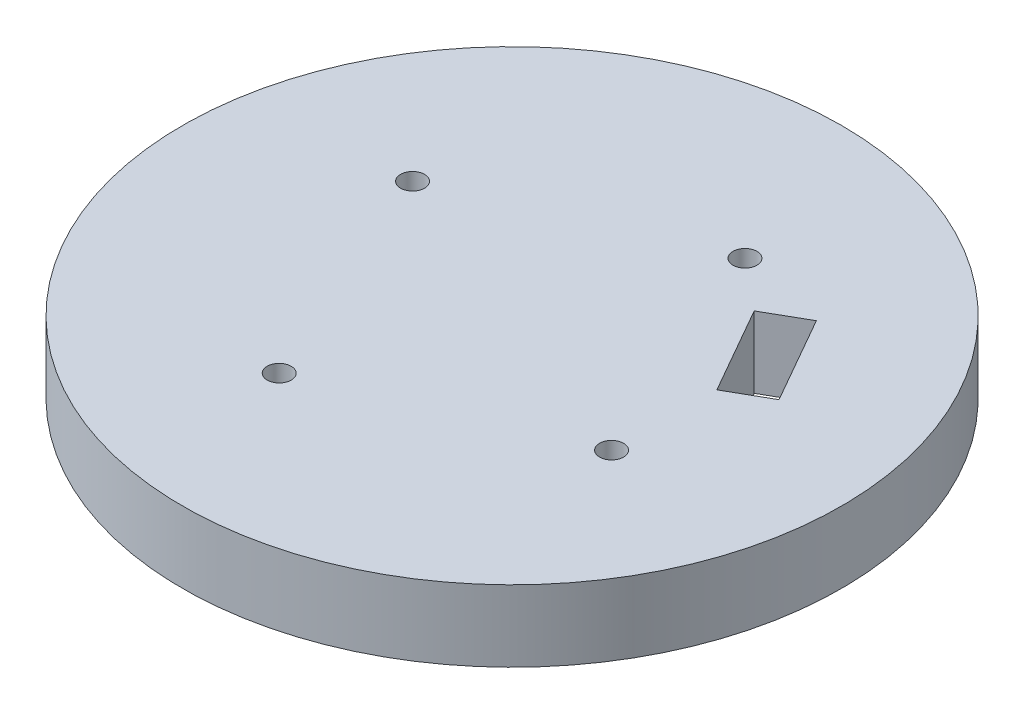
ISO-10303-21;
HEADER;
FILE_DESCRIPTION(('STEP AP214'),'2;1');
FILE_NAME('part.step','',(''),(''),'','','');
FILE_SCHEMA(('AUTOMOTIVE_DESIGN { 1 0 10303 214 1 1 1 1 }'));
ENDSEC;
DATA;
#1=APPLICATION_CONTEXT('core data for automotive mechanical design processes');
#2=APPLICATION_PROTOCOL_DEFINITION('international standard','automotive_design',2000,#1);
#3=PRODUCT_CONTEXT('',#1,'mechanical');
#4=PRODUCT('Part','Part','',(#3));
#5=PRODUCT_RELATED_PRODUCT_CATEGORY('part','',(#4));
#6=PRODUCT_DEFINITION_FORMATION('','',#4);
#7=PRODUCT_DEFINITION_CONTEXT('part definition',#1,'design');
#8=PRODUCT_DEFINITION('design','',#6,#7);
#9=PRODUCT_DEFINITION_SHAPE('','',#8);
#10=(LENGTH_UNIT() NAMED_UNIT(*) SI_UNIT(.MILLI.,.METRE.));
#11=(NAMED_UNIT(*) PLANE_ANGLE_UNIT() SI_UNIT($,.RADIAN.));
#12=(NAMED_UNIT(*) SI_UNIT($,.STERADIAN.) SOLID_ANGLE_UNIT());
#13=UNCERTAINTY_MEASURE_WITH_UNIT(LENGTH_MEASURE(1.E-05),#10,'distance_accuracy_value','');
#14=(GEOMETRIC_REPRESENTATION_CONTEXT(3) GLOBAL_UNCERTAINTY_ASSIGNED_CONTEXT((#13)) GLOBAL_UNIT_ASSIGNED_CONTEXT((#10,
#11,#12)) REPRESENTATION_CONTEXT('',''));
#15=CARTESIAN_POINT('',(0.,0.,0.));
#16=DIRECTION('',(0.,0.,1.));
#17=DIRECTION('',(1.,0.,0.));
#18=AXIS2_PLACEMENT_3D('',#15,#16,#17);
#19=CARTESIAN_POINT('',(0.,20.,0.));
#20=DIRECTION('',(0.,-1.,0.));
#21=DIRECTION('',(0.,0.,-1.));
#22=AXIS2_PLACEMENT_3D('',#19,#20,#21);
#23=CYLINDRICAL_SURFACE('',#22,27.5);
#24=CARTESIAN_POINT('',(0.,20.,0.));
#25=DIRECTION('',(0.,1.,0.));
#26=DIRECTION('',(0.,0.,1.));
#27=AXIS2_PLACEMENT_3D('',#24,#25,#26);
#28=CIRCLE('',#27,27.5);
#29=CARTESIAN_POINT('',(0.,20.,27.5));
#30=VERTEX_POINT('',#29);
#31=EDGE_CURVE('E11',#30,#30,#28,.T.);
#32=ORIENTED_EDGE('',*,*,#31,.F.);
#33=EDGE_LOOP('',(#32));
#34=FACE_BOUND('',#33,.T.);
#35=CARTESIAN_POINT('',(0.,0.,0.));
#36=DIRECTION('',(0.,1.,0.));
#37=DIRECTION('',(0.,0.,1.));
#38=AXIS2_PLACEMENT_3D('',#35,#36,#37);
#39=CIRCLE('',#38,27.5);
#40=CARTESIAN_POINT('',(0.,0.,27.5));
#41=VERTEX_POINT('',#40);
#42=EDGE_CURVE('E41',#41,#41,#39,.T.);
#43=ORIENTED_EDGE('',*,*,#42,.T.);
#44=EDGE_LOOP('',(#43));
#45=FACE_BOUND('',#44,.T.);
#46=ADVANCED_FACE('F38',(#34,#45),#23,.T.);
#47=CARTESIAN_POINT('',(0.,0.,0.));
#48=DIRECTION('',(0.,1.,0.));
#49=DIRECTION('',(0.,0.,1.));
#50=AXIS2_PLACEMENT_3D('',#47,#48,#49);
#51=PLANE('',#50);
#52=CARTESIAN_POINT('',(15.8292914487116,0.,12.2243008892839));
#53=DIRECTION('',(0.,-1.,0.));
#54=DIRECTION('',(0.,0.,-1.));
#55=AXIS2_PLACEMENT_3D('',#52,#53,#54);
#56=CIRCLE('',#55,2.);
#57=CARTESIAN_POINT('',(15.8292914487116,0.,10.2243008892839));
#58=VERTEX_POINT('',#57);
#59=EDGE_CURVE('E136',#58,#58,#56,.T.);
#60=ORIENTED_EDGE('',*,*,#59,.F.);
#61=EDGE_LOOP('',(#60));
#62=FACE_BOUND('',#61,.T.);
#63=CARTESIAN_POINT('',(-12.2243008892839,0.,15.8292914487116));
#64=DIRECTION('',(0.,-1.,0.));
#65=DIRECTION('',(0.,0.,-1.));
#66=AXIS2_PLACEMENT_3D('',#63,#64,#65);
#67=CIRCLE('',#66,2.);
#68=CARTESIAN_POINT('',(-12.2243008892839,0.,13.8292914487116));
#69=VERTEX_POINT('',#68);
#70=EDGE_CURVE('E130',#69,#69,#67,.T.);
#71=ORIENTED_EDGE('',*,*,#70,.F.);
#72=EDGE_LOOP('',(#71));
#73=FACE_BOUND('',#72,.T.);
#74=CARTESIAN_POINT('',(-15.8292914487116,0.,-12.2243008892839));
#75=DIRECTION('',(0.,-1.,0.));
#76=DIRECTION('',(0.,0.,-1.));
#77=AXIS2_PLACEMENT_3D('',#74,#75,#76);
#78=CIRCLE('',#77,2.);
#79=CARTESIAN_POINT('',(-15.8292914487116,0.,-14.2243008892839));
#80=VERTEX_POINT('',#79);
#81=EDGE_CURVE('E123',#80,#80,#78,.T.);
#82=ORIENTED_EDGE('',*,*,#81,.F.);
#83=EDGE_LOOP('',(#82));
#84=FACE_BOUND('',#83,.T.);
#85=CARTESIAN_POINT('',(12.2243008892839,0.,-15.8292914487116));
#86=DIRECTION('',(0.,-1.,0.));
#87=DIRECTION('',(0.,0.,-1.));
#88=AXIS2_PLACEMENT_3D('',#85,#86,#87);
#89=CIRCLE('',#88,2.);
#90=CARTESIAN_POINT('',(12.2243008892839,0.,-17.8292914487116));
#91=VERTEX_POINT('',#90);
#92=EDGE_CURVE('E126',#91,#91,#89,.T.);
#93=ORIENTED_EDGE('',*,*,#92,.F.);
#94=EDGE_LOOP('',(#93));
#95=FACE_BOUND('',#94,.T.);
#96=ORIENTED_EDGE('',*,*,#42,.F.);
#97=EDGE_LOOP('',(#96));
#98=FACE_BOUND('',#97,.T.);
#99=ADVANCED_FACE('F180',(#62,#73,#84,#95,#98),#51,.F.);
#100=CARTESIAN_POINT('',(12.2243008892839,10.,-15.8292914487116));
#101=DIRECTION('',(0.,-1.,0.));
#102=DIRECTION('',(0.,0.,-1.));
#103=AXIS2_PLACEMENT_3D('',#100,#101,#102);
#104=CYLINDRICAL_SURFACE('',#103,2.);
#105=CARTESIAN_POINT('',(12.2243008892839,10.,-15.8292914487116));
#106=DIRECTION('',(0.,-1.,0.));
#107=DIRECTION('',(0.,0.,-1.));
#108=AXIS2_PLACEMENT_3D('',#105,#106,#107);
#109=CIRCLE('',#108,2.);
#110=CARTESIAN_POINT('',(12.2243008892839,10.,-17.8292914487116));
#111=VERTEX_POINT('',#110);
#112=EDGE_CURVE('E142',#111,#111,#109,.T.);
#113=ORIENTED_EDGE('',*,*,#112,.F.);
#114=EDGE_LOOP('',(#113));
#115=FACE_BOUND('',#114,.T.);
#116=ORIENTED_EDGE('',*,*,#92,.T.);
#117=EDGE_LOOP('',(#116));
#118=FACE_BOUND('',#117,.T.);
#119=ADVANCED_FACE('F178',(#115,#118),#104,.F.);
#120=CARTESIAN_POINT('',(12.2243008892839,10.,-15.8292914487116));
#121=DIRECTION('',(0.,-1.,0.));
#122=DIRECTION('',(0.,0.,-1.));
#123=AXIS2_PLACEMENT_3D('',#120,#121,#122);
#124=PLANE('',#123);
#125=ORIENTED_EDGE('',*,*,#112,.T.);
#126=EDGE_LOOP('',(#125));
#127=FACE_BOUND('',#126,.T.);
#128=ADVANCED_FACE('F187',(#127),#124,.T.);
#129=CARTESIAN_POINT('',(-15.8292914487116,10.,-12.2243008892839));
#130=DIRECTION('',(0.,-1.,0.));
#131=DIRECTION('',(0.,0.,-1.));
#132=AXIS2_PLACEMENT_3D('',#129,#130,#131);
#133=CYLINDRICAL_SURFACE('',#132,2.);
#134=CARTESIAN_POINT('',(-15.8292914487116,10.,-12.2243008892839));
#135=DIRECTION('',(0.,-1.,0.));
#136=DIRECTION('',(0.,0.,-1.));
#137=AXIS2_PLACEMENT_3D('',#134,#135,#136);
#138=CIRCLE('',#137,2.);
#139=CARTESIAN_POINT('',(-15.8292914487116,10.,-14.2243008892839));
#140=VERTEX_POINT('',#139);
#141=EDGE_CURVE('E127',#140,#140,#138,.T.);
#142=ORIENTED_EDGE('',*,*,#141,.F.);
#143=EDGE_LOOP('',(#142));
#144=FACE_BOUND('',#143,.T.);
#145=ORIENTED_EDGE('',*,*,#81,.T.);
#146=EDGE_LOOP('',(#145));
#147=FACE_BOUND('',#146,.T.);
#148=ADVANCED_FACE('F203',(#144,#147),#133,.F.);
#149=CARTESIAN_POINT('',(-15.8292914487116,10.,-12.2243008892839));
#150=DIRECTION('',(0.,-1.,0.));
#151=DIRECTION('',(0.,0.,-1.));
#152=AXIS2_PLACEMENT_3D('',#149,#150,#151);
#153=PLANE('',#152);
#154=ORIENTED_EDGE('',*,*,#141,.T.);
#155=EDGE_LOOP('',(#154));
#156=FACE_BOUND('',#155,.T.);
#157=ADVANCED_FACE('F205',(#156),#153,.T.);
#158=CARTESIAN_POINT('',(-12.2243008892839,10.,15.8292914487116));
#159=DIRECTION('',(0.,-1.,0.));
#160=DIRECTION('',(0.,0.,-1.));
#161=AXIS2_PLACEMENT_3D('',#158,#159,#160);
#162=CYLINDRICAL_SURFACE('',#161,2.);
#163=CARTESIAN_POINT('',(-12.2243008892839,10.,15.8292914487116));
#164=DIRECTION('',(0.,-1.,0.));
#165=DIRECTION('',(0.,0.,-1.));
#166=AXIS2_PLACEMENT_3D('',#163,#164,#165);
#167=CIRCLE('',#166,2.);
#168=CARTESIAN_POINT('',(-12.2243008892839,10.,13.8292914487116));
#169=VERTEX_POINT('',#168);
#170=EDGE_CURVE('E133',#169,#169,#167,.T.);
#171=ORIENTED_EDGE('',*,*,#170,.F.);
#172=EDGE_LOOP('',(#171));
#173=FACE_BOUND('',#172,.T.);
#174=ORIENTED_EDGE('',*,*,#70,.T.);
#175=EDGE_LOOP('',(#174));
#176=FACE_BOUND('',#175,.T.);
#177=ADVANCED_FACE('F212',(#173,#176),#162,.F.);
#178=CARTESIAN_POINT('',(-12.2243008892839,10.,15.8292914487116));
#179=DIRECTION('',(0.,-1.,0.));
#180=DIRECTION('',(0.,0.,-1.));
#181=AXIS2_PLACEMENT_3D('',#178,#179,#180);
#182=PLANE('',#181);
#183=ORIENTED_EDGE('',*,*,#170,.T.);
#184=EDGE_LOOP('',(#183));
#185=FACE_BOUND('',#184,.T.);
#186=ADVANCED_FACE('F221',(#185),#182,.T.);
#187=CARTESIAN_POINT('',(15.8292914487116,10.,12.2243008892839));
#188=DIRECTION('',(0.,-1.,0.));
#189=DIRECTION('',(0.,0.,-1.));
#190=AXIS2_PLACEMENT_3D('',#187,#188,#189);
#191=CYLINDRICAL_SURFACE('',#190,2.);
#192=CARTESIAN_POINT('',(15.8292914487116,10.,12.2243008892839));
#193=DIRECTION('',(0.,-1.,0.));
#194=DIRECTION('',(0.,0.,-1.));
#195=AXIS2_PLACEMENT_3D('',#192,#193,#194);
#196=CIRCLE('',#195,2.);
#197=CARTESIAN_POINT('',(15.8292914487116,10.,10.2243008892839));
#198=VERTEX_POINT('',#197);
#199=EDGE_CURVE('E139',#198,#198,#196,.T.);
#200=ORIENTED_EDGE('',*,*,#199,.F.);
#201=EDGE_LOOP('',(#200));
#202=FACE_BOUND('',#201,.T.);
#203=ORIENTED_EDGE('',*,*,#59,.T.);
#204=EDGE_LOOP('',(#203));
#205=FACE_BOUND('',#204,.T.);
#206=ADVANCED_FACE('F225',(#202,#205),#191,.F.);
#207=CARTESIAN_POINT('',(15.8292914487116,10.,12.2243008892839));
#208=DIRECTION('',(0.,-1.,0.));
#209=DIRECTION('',(0.,0.,-1.));
#210=AXIS2_PLACEMENT_3D('',#207,#208,#209);
#211=PLANE('',#210);
#212=ORIENTED_EDGE('',*,*,#199,.T.);
#213=EDGE_LOOP('',(#212));
#214=FACE_BOUND('',#213,.T.);
#215=ADVANCED_FACE('F169',(#214),#211,.T.);
#216=CARTESIAN_POINT('',(0.,20.,0.));
#217=DIRECTION('',(0.,1.,0.));
#218=DIRECTION('',(0.,0.,1.));
#219=AXIS2_PLACEMENT_3D('',#216,#217,#218);
#220=PLANE('',#219);
#221=CARTESIAN_POINT('',(-30.256887417686,20.,-12.1417625440307));
#222=DIRECTION('',(0.,-1.,0.));
#223=DIRECTION('',(0.,0.,-1.));
#224=AXIS2_PLACEMENT_3D('',#221,#222,#223);
#225=CIRCLE('',#224,2.18645669799799);
#226=CARTESIAN_POINT('',(-30.256887417686,20.,-14.3282192420287));
#227=VERTEX_POINT('',#226);
#228=EDGE_CURVE('E454',#227,#227,#225,.T.);
#229=ORIENTED_EDGE('',*,*,#228,.F.);
#230=EDGE_LOOP('',(#229));
#231=FACE_BOUND('',#230,.T.);
#232=CARTESIAN_POINT('',(12.1417625440307,20.,-30.256887417686));
#233=DIRECTION('',(0.,-1.,0.));
#234=DIRECTION('',(0.,0.,-1.));
#235=AXIS2_PLACEMENT_3D('',#232,#233,#234);
#236=CIRCLE('',#235,2.18645669799799);
#237=CARTESIAN_POINT('',(12.1417625440307,20.,-32.443344115684));
#238=VERTEX_POINT('',#237);
#239=EDGE_CURVE('E455',#238,#238,#236,.T.);
#240=ORIENTED_EDGE('',*,*,#239,.F.);
#241=EDGE_LOOP('',(#240));
#242=FACE_BOUND('',#241,.T.);
#243=CARTESIAN_POINT('',(30.256887417686,20.,12.1417625440307));
#244=DIRECTION('',(0.,-1.,0.));
#245=DIRECTION('',(0.,0.,-1.));
#246=AXIS2_PLACEMENT_3D('',#243,#244,#245);
#247=CIRCLE('',#246,2.18645669799799);
#248=CARTESIAN_POINT('',(30.256887417686,20.,9.9553058460327));
#249=VERTEX_POINT('',#248);
#250=EDGE_CURVE('E464',#249,#249,#247,.T.);
#251=ORIENTED_EDGE('',*,*,#250,.F.);
#252=EDGE_LOOP('',(#251));
#253=FACE_BOUND('',#252,.T.);
#254=CARTESIAN_POINT('',(-12.1417625440307,20.,30.256887417686));
#255=DIRECTION('',(0.,-1.,0.));
#256=DIRECTION('',(0.,0.,-1.));
#257=AXIS2_PLACEMENT_3D('',#254,#255,#256);
#258=CIRCLE('',#257,2.18645669799799);
#259=CARTESIAN_POINT('',(-12.1417625440307,20.,28.070430719688));
#260=VERTEX_POINT('',#259);
#261=EDGE_CURVE('E470',#260,#260,#258,.T.);
#262=ORIENTED_EDGE('',*,*,#261,.F.);
#263=EDGE_LOOP('',(#262));
#264=FACE_BOUND('',#263,.T.);
#265=DIRECTION('',(0.86838593823356,0.,-0.495888961641838));
#266=VECTOR('',#265,1.);
#267=CARTESIAN_POINT('',(4.46398311951462,20.,7.81719390700675));
#268=LINE('',#267,#266);
#269=CARTESIAN_POINT('',(30.330623273801,20.,-6.95386670385982));
#270=VERTEX_POINT('',#269);
#271=CARTESIAN_POINT('',(37.5336445647121,20.,-11.067128551351));
#272=VERTEX_POINT('',#271);
#273=EDGE_CURVE('E110',#270,#272,#268,.T.);
#274=ORIENTED_EDGE('',*,*,#273,.T.);
#275=DIRECTION('',(-0.495888961641838,0.,-0.86838593823356));
#276=VECTOR('',#275,1.);
#277=CARTESIAN_POINT('',(33.0696614451975,20.,-18.8843224583578));
#278=LINE('',#277,#276);
#279=CARTESIAN_POINT('',(28.4832933167084,20.,-26.9158333376403));
#280=VERTEX_POINT('',#279);
#281=EDGE_CURVE('E113',#272,#280,#278,.T.);
#282=ORIENTED_EDGE('',*,*,#281,.T.);
#283=DIRECTION('',(-0.86838593823356,0.,0.495888961641838));
#284=VECTOR('',#283,1.);
#285=CARTESIAN_POINT('',(-4.58636812848911,20.,-8.03151087928249));
#286=LINE('',#285,#284);
#287=CARTESIAN_POINT('',(21.2802720257973,20.,-22.8025714901491));
#288=VERTEX_POINT('',#287);
#289=EDGE_CURVE('E105',#280,#288,#286,.T.);
#290=ORIENTED_EDGE('',*,*,#289,.T.);
#291=DIRECTION('',(0.495888961641838,0.,0.86838593823356));
#292=VECTOR('',#291,1.);
#293=CARTESIAN_POINT('',(25.8666401542864,20.,-14.7710606108666));
#294=LINE('',#293,#292);
#295=EDGE_CURVE('E85',#288,#270,#294,.T.);
#296=ORIENTED_EDGE('',*,*,#295,.T.);
#297=EDGE_LOOP('',(#274,#282,#290,#296));
#298=FACE_BOUND('',#297,.T.);
#299=ORIENTED_EDGE('',*,*,#31,.T.);
#300=EDGE_LOOP('',(#299));
#301=FACE_BOUND('',#300,.T.);
#302=CARTESIAN_POINT('',(0.,20.,0.));
#303=DIRECTION('',(0.,1.,0.));
#304=DIRECTION('',(0.,0.,1.));
#305=AXIS2_PLACEMENT_3D('',#302,#303,#304);
#306=CIRCLE('',#305,60.000000000019);
#307=CARTESIAN_POINT('',(0.,20.,-60.000000000019));
#308=VERTEX_POINT('',#307);
#309=EDGE_CURVE('E116',#308,#308,#306,.T.);
#310=ORIENTED_EDGE('',*,*,#309,.F.);
#311=EDGE_LOOP('',(#310));
#312=FACE_BOUND('',#311,.T.);
#313=ADVANCED_FACE('F158',(#231,#242,#253,#264,#298,#301,#312),#220,.F.);
#314=CARTESIAN_POINT('',(0.,33.,0.));
#315=DIRECTION('',(0.,1.,0.));
#316=DIRECTION('',(0.,0.,1.));
#317=AXIS2_PLACEMENT_3D('',#314,#315,#316);
#318=PLANE('',#317);
#319=CARTESIAN_POINT('',(-30.256887417686,33.,-12.1417625440307));
#320=DIRECTION('',(0.,-1.,0.));
#321=DIRECTION('',(0.,0.,-1.));
#322=AXIS2_PLACEMENT_3D('',#319,#320,#321);
#323=CIRCLE('',#322,2.18645669799799);
#324=CARTESIAN_POINT('',(-30.256887417686,33.,-14.3282192420287));
#325=VERTEX_POINT('',#324);
#326=EDGE_CURVE('E451',#325,#325,#323,.T.);
#327=ORIENTED_EDGE('',*,*,#326,.T.);
#328=EDGE_LOOP('',(#327));
#329=FACE_BOUND('',#328,.T.);
#330=CARTESIAN_POINT('',(12.1417625440307,33.,-30.256887417686));
#331=DIRECTION('',(0.,-1.,0.));
#332=DIRECTION('',(0.,0.,-1.));
#333=AXIS2_PLACEMENT_3D('',#330,#331,#332);
#334=CIRCLE('',#333,2.18645669799799);
#335=CARTESIAN_POINT('',(12.1417625440307,33.,-32.443344115684));
#336=VERTEX_POINT('',#335);
#337=EDGE_CURVE('E459',#336,#336,#334,.T.);
#338=ORIENTED_EDGE('',*,*,#337,.T.);
#339=EDGE_LOOP('',(#338));
#340=FACE_BOUND('',#339,.T.);
#341=CARTESIAN_POINT('',(30.256887417686,33.,12.1417625440307));
#342=DIRECTION('',(0.,-1.,0.));
#343=DIRECTION('',(0.,0.,-1.));
#344=AXIS2_PLACEMENT_3D('',#341,#342,#343);
#345=CIRCLE('',#344,2.18645669799799);
#346=CARTESIAN_POINT('',(30.256887417686,33.,9.9553058460327));
#347=VERTEX_POINT('',#346);
#348=EDGE_CURVE('E467',#347,#347,#345,.T.);
#349=ORIENTED_EDGE('',*,*,#348,.T.);
#350=EDGE_LOOP('',(#349));
#351=FACE_BOUND('',#350,.T.);
#352=CARTESIAN_POINT('',(-12.1417625440307,33.,30.256887417686));
#353=DIRECTION('',(0.,-1.,0.));
#354=DIRECTION('',(0.,0.,-1.));
#355=AXIS2_PLACEMENT_3D('',#352,#353,#354);
#356=CIRCLE('',#355,2.18645669799799);
#357=CARTESIAN_POINT('',(-12.1417625440307,33.,28.070430719688));
#358=VERTEX_POINT('',#357);
#359=EDGE_CURVE('E473',#358,#358,#356,.T.);
#360=ORIENTED_EDGE('',*,*,#359,.T.);
#361=EDGE_LOOP('',(#360));
#362=FACE_BOUND('',#361,.T.);
#363=DIRECTION('',(-0.495888961641838,0.,-0.86838593823356));
#364=VECTOR('',#363,1.);
#365=CARTESIAN_POINT('',(37.5336445647121,33.,-11.067128551351));
#366=LINE('',#365,#364);
#367=CARTESIAN_POINT('',(37.5336445647121,33.,-11.067128551351));
#368=VERTEX_POINT('',#367);
#369=CARTESIAN_POINT('',(28.4832933167084,33.,-26.9158333376403));
#370=VERTEX_POINT('',#369);
#371=EDGE_CURVE('E61',#368,#370,#366,.T.);
#372=ORIENTED_EDGE('',*,*,#371,.F.);
#373=DIRECTION('',(0.86838593823356,0.,-0.495888961641838));
#374=VECTOR('',#373,1.);
#375=CARTESIAN_POINT('',(30.330623273801,33.,-6.95386670385982));
#376=LINE('',#375,#374);
#377=CARTESIAN_POINT('',(30.330623273801,33.,-6.95386670385982));
#378=VERTEX_POINT('',#377);
#379=EDGE_CURVE('E98',#378,#368,#376,.T.);
#380=ORIENTED_EDGE('',*,*,#379,.F.);
#381=DIRECTION('',(0.495888961641838,0.,0.86838593823356));
#382=VECTOR('',#381,1.);
#383=CARTESIAN_POINT('',(21.2802720257973,33.,-22.8025714901491));
#384=LINE('',#383,#382);
#385=CARTESIAN_POINT('',(21.2802720257973,33.,-22.8025714901491));
#386=VERTEX_POINT('',#385);
#387=EDGE_CURVE('E82',#386,#378,#384,.T.);
#388=ORIENTED_EDGE('',*,*,#387,.F.);
#389=DIRECTION('',(-0.86838593823356,0.,0.495888961641838));
#390=VECTOR('',#389,1.);
#391=CARTESIAN_POINT('',(28.4832933167084,33.,-26.9158333376403));
#392=LINE('',#391,#390);
#393=EDGE_CURVE('E91',#370,#386,#392,.T.);
#394=ORIENTED_EDGE('',*,*,#393,.F.);
#395=EDGE_LOOP('',(#372,#380,#388,#394));
#396=FACE_BOUND('',#395,.T.);
#397=CARTESIAN_POINT('',(0.,33.,0.));
#398=DIRECTION('',(0.,1.,0.));
#399=DIRECTION('',(0.,0.,1.));
#400=AXIS2_PLACEMENT_3D('',#397,#398,#399);
#401=CIRCLE('',#400,60.000000000019);
#402=CARTESIAN_POINT('',(0.,33.,-60.000000000019));
#403=VERTEX_POINT('',#402);
#404=EDGE_CURVE('E117',#403,#403,#401,.T.);
#405=ORIENTED_EDGE('',*,*,#404,.T.);
#406=EDGE_LOOP('',(#405));
#407=FACE_BOUND('',#406,.T.);
#408=ADVANCED_FACE('F95',(#329,#340,#351,#362,#396,#407),#318,.T.);
#409=CARTESIAN_POINT('',(0.,33.,0.));
#410=DIRECTION('',(0.,-1.,0.));
#411=DIRECTION('',(0.,0.,-1.));
#412=AXIS2_PLACEMENT_3D('',#409,#410,#411);
#413=CYLINDRICAL_SURFACE('',#412,60.000000000019);
#414=CARTESIAN_POINT('',(0.,33.,-60.000000000019));
#415=CARTESIAN_POINT('',(0.,32.8645833333333,-60.000000000019));
#416=CARTESIAN_POINT('',(0.,32.7291666666667,-60.000000000019));
#417=CARTESIAN_POINT('',(0.,32.4583333333333,-60.000000000019));
#418=CARTESIAN_POINT('',(0.,32.3229166666667,-60.000000000019));
#419=CARTESIAN_POINT('',(0.,32.0520833333333,-60.000000000019));
#420=CARTESIAN_POINT('',(0.,31.9166666666667,-60.000000000019));
#421=CARTESIAN_POINT('',(0.,31.6458333333333,-60.000000000019));
#422=CARTESIAN_POINT('',(0.,31.5104166666667,-60.000000000019));
#423=CARTESIAN_POINT('',(0.,31.2395833333333,-60.000000000019));
#424=CARTESIAN_POINT('',(0.,31.1041666666667,-60.000000000019));
#425=CARTESIAN_POINT('',(0.,30.8333333333333,-60.000000000019));
#426=CARTESIAN_POINT('',(0.,30.6979166666667,-60.000000000019));
#427=CARTESIAN_POINT('',(0.,30.4270833333333,-60.000000000019));
#428=CARTESIAN_POINT('',(0.,30.2916666666667,-60.000000000019));
#429=CARTESIAN_POINT('',(0.,30.0208333333333,-60.000000000019));
#430=CARTESIAN_POINT('',(0.,29.8854166666667,-60.000000000019));
#431=CARTESIAN_POINT('',(0.,29.6145833333333,-60.000000000019));
#432=CARTESIAN_POINT('',(0.,29.4791666666667,-60.000000000019));
#433=CARTESIAN_POINT('',(0.,29.2083333333333,-60.000000000019));
#434=CARTESIAN_POINT('',(0.,29.0729166666667,-60.000000000019));
#435=CARTESIAN_POINT('',(0.,28.8020833333333,-60.000000000019));
#436=CARTESIAN_POINT('',(0.,28.6666666666667,-60.000000000019));
#437=CARTESIAN_POINT('',(0.,28.3958333333333,-60.000000000019));
#438=CARTESIAN_POINT('',(0.,28.2604166666667,-60.000000000019));
#439=CARTESIAN_POINT('',(0.,27.9895833333333,-60.000000000019));
#440=CARTESIAN_POINT('',(0.,27.8541666666667,-60.000000000019));
#441=CARTESIAN_POINT('',(0.,27.5833333333333,-60.000000000019));
#442=CARTESIAN_POINT('',(0.,27.4479166666667,-60.000000000019));
#443=CARTESIAN_POINT('',(0.,27.1770833333333,-60.000000000019));
#444=CARTESIAN_POINT('',(0.,27.0416666666667,-60.000000000019));
#445=CARTESIAN_POINT('',(0.,26.7708333333333,-60.000000000019));
#446=CARTESIAN_POINT('',(0.,26.6354166666667,-60.000000000019));
#447=CARTESIAN_POINT('',(0.,26.3645833333333,-60.000000000019));
#448=CARTESIAN_POINT('',(0.,26.2291666666667,-60.000000000019));
#449=CARTESIAN_POINT('',(0.,25.9583333333333,-60.000000000019));
#450=CARTESIAN_POINT('',(0.,25.8229166666667,-60.000000000019));
#451=CARTESIAN_POINT('',(0.,25.5520833333333,-60.000000000019));
#452=CARTESIAN_POINT('',(0.,25.4166666666667,-60.000000000019));
#453=CARTESIAN_POINT('',(0.,25.1458333333333,-60.000000000019));
#454=CARTESIAN_POINT('',(0.,25.0104166666667,-60.000000000019));
#455=CARTESIAN_POINT('',(0.,24.7395833333333,-60.000000000019));
#456=CARTESIAN_POINT('',(0.,24.6041666666667,-60.000000000019));
#457=CARTESIAN_POINT('',(0.,24.3333333333333,-60.000000000019));
#458=CARTESIAN_POINT('',(0.,24.1979166666667,-60.000000000019));
#459=CARTESIAN_POINT('',(0.,23.9270833333333,-60.000000000019));
#460=CARTESIAN_POINT('',(0.,23.7916666666667,-60.000000000019));
#461=CARTESIAN_POINT('',(0.,23.5208333333333,-60.000000000019));
#462=CARTESIAN_POINT('',(0.,23.3854166666667,-60.000000000019));
#463=CARTESIAN_POINT('',(0.,23.1145833333333,-60.000000000019));
#464=CARTESIAN_POINT('',(0.,22.9791666666667,-60.000000000019));
#465=CARTESIAN_POINT('',(0.,22.7083333333333,-60.000000000019));
#466=CARTESIAN_POINT('',(0.,22.5729166666667,-60.000000000019));
#467=CARTESIAN_POINT('',(0.,22.3020833333333,-60.000000000019));
#468=CARTESIAN_POINT('',(0.,22.1666666666667,-60.000000000019));
#469=CARTESIAN_POINT('',(0.,21.8958333333333,-60.000000000019));
#470=CARTESIAN_POINT('',(0.,21.7604166666667,-60.000000000019));
#471=CARTESIAN_POINT('',(0.,21.4895833333333,-60.000000000019));
#472=CARTESIAN_POINT('',(0.,21.3541666666667,-60.000000000019));
#473=CARTESIAN_POINT('',(0.,21.0833333333333,-60.000000000019));
#474=CARTESIAN_POINT('',(0.,20.9479166666667,-60.000000000019));
#475=CARTESIAN_POINT('',(0.,20.6770833333333,-60.000000000019));
#476=CARTESIAN_POINT('',(0.,20.5416666666667,-60.000000000019));
#477=CARTESIAN_POINT('',(0.,20.2708333333333,-60.000000000019));
#478=CARTESIAN_POINT('',(0.,20.1354166666667,-60.000000000019));
#479=CARTESIAN_POINT('',(0.,20.,-60.000000000019));
#480=B_SPLINE_CURVE_WITH_KNOTS('',3,(#414,#415,#416,#417,#418,#419,#420,#421,#422,#423,#424,
#425,#426,#427,#428,#429,#430,#431,#432,#433,#434,#435,#436,#437,#438,#439,#440,#441,#442,#443,
#444,#445,#446,#447,#448,#449,#450,#451,#452,#453,#454,#455,#456,#457,#458,#459,#460,#461,#462,
#463,#464,#465,#466,#467,#468,#469,#470,#471,#472,#473,#474,#475,#476,#477,#478,#479),
.UNSPECIFIED.,.F.,.F.,(4,2,2,2,2,2,2,2,2,2,2,2,2,2,2,2,2,2,2,2,2,2,2,2,2,2,2,2,2,2,2,2,4),(0.,
0.406249999999997,0.812499999999994,1.21875,1.62499999999999,2.03124999999999,2.4375,2.84375,
3.25,3.65625,4.0625,4.46875,4.875,5.28124999999999,5.6875,6.09374999999999,6.5,6.90625,7.3125,
7.71875,8.12499999999999,8.53125,8.93749999999999,9.34375,9.74999999999999,10.15625,10.5625,
10.96875,11.375,11.78125,12.1875,12.59375,13.),.UNSPECIFIED.);
#481=EDGE_CURVE('BSEAM217',#403,#308,#480,.T.);
#482=ORIENTED_EDGE('',*,*,#404,.F.);
#483=ORIENTED_EDGE('',*,*,#309,.T.);
#484=ORIENTED_EDGE('',*,*,#481,.T.);
#485=ORIENTED_EDGE('',*,*,#481,.F.);
#486=EDGE_LOOP('',(#482,#484,#483,#485));
#487=FACE_BOUND('',#486,.T.);
#488=ADVANCED_FACE('F217',(#487),#413,.T.);
#489=CARTESIAN_POINT('',(37.5336445647121,0.,-11.067128551351));
#490=DIRECTION('',(0.86838593823356,0.,-0.495888961641838));
#491=DIRECTION('',(-0.495888961641838,0.,-0.86838593823356));
#492=AXIS2_PLACEMENT_3D('',#489,#490,#491);
#493=PLANE('',#492);
#494=DIRECTION('',(0.,1.,0.));
#495=VECTOR('',#494,1.);
#496=CARTESIAN_POINT('',(37.5336445647121,0.,-11.067128551351));
#497=LINE('',#496,#495);
#498=EDGE_CURVE('E103',#272,#368,#497,.T.);
#499=ORIENTED_EDGE('',*,*,#498,.T.);
#500=ORIENTED_EDGE('',*,*,#371,.T.);
#501=DIRECTION('',(0.,1.,0.));
#502=VECTOR('',#501,1.);
#503=CARTESIAN_POINT('',(28.4832933167084,0.,-26.9158333376403));
#504=LINE('',#503,#502);
#505=EDGE_CURVE('E88',#280,#370,#504,.T.);
#506=ORIENTED_EDGE('',*,*,#505,.F.);
#507=ORIENTED_EDGE('',*,*,#281,.F.);
#508=EDGE_LOOP('',(#499,#500,#506,#507));
#509=FACE_BOUND('',#508,.T.);
#510=ADVANCED_FACE('F256',(#509),#493,.F.);
#511=CARTESIAN_POINT('',(30.330623273801,0.,-6.95386670385982));
#512=DIRECTION('',(0.495888961641838,0.,0.86838593823356));
#513=DIRECTION('',(0.86838593823356,0.,-0.495888961641838));
#514=AXIS2_PLACEMENT_3D('',#511,#512,#513);
#515=PLANE('',#514);
#516=DIRECTION('',(0.,1.,0.));
#517=VECTOR('',#516,1.);
#518=CARTESIAN_POINT('',(30.330623273801,0.,-6.95386670385982));
#519=LINE('',#518,#517);
#520=EDGE_CURVE('E87',#270,#378,#519,.T.);
#521=ORIENTED_EDGE('',*,*,#520,.T.);
#522=ORIENTED_EDGE('',*,*,#379,.T.);
#523=ORIENTED_EDGE('',*,*,#498,.F.);
#524=ORIENTED_EDGE('',*,*,#273,.F.);
#525=EDGE_LOOP('',(#521,#522,#523,#524));
#526=FACE_BOUND('',#525,.T.);
#527=ADVANCED_FACE('F263',(#526),#515,.F.);
#528=CARTESIAN_POINT('',(21.2802720257973,0.,-22.8025714901491));
#529=DIRECTION('',(-0.86838593823356,0.,0.495888961641838));
#530=DIRECTION('',(0.495888961641838,0.,0.86838593823356));
#531=AXIS2_PLACEMENT_3D('',#528,#529,#530);
#532=PLANE('',#531);
#533=DIRECTION('',(0.,1.,0.));
#534=VECTOR('',#533,1.);
#535=CARTESIAN_POINT('',(21.2802720257973,0.,-22.8025714901491));
#536=LINE('',#535,#534);
#537=EDGE_CURVE('E53',#288,#386,#536,.T.);
#538=ORIENTED_EDGE('',*,*,#537,.T.);
#539=ORIENTED_EDGE('',*,*,#387,.T.);
#540=ORIENTED_EDGE('',*,*,#520,.F.);
#541=ORIENTED_EDGE('',*,*,#295,.F.);
#542=EDGE_LOOP('',(#538,#539,#540,#541));
#543=FACE_BOUND('',#542,.T.);
#544=ADVANCED_FACE('F79',(#543),#532,.F.);
#545=CARTESIAN_POINT('',(28.4832933167084,0.,-26.9158333376403));
#546=DIRECTION('',(-0.495888961641838,0.,-0.86838593823356));
#547=DIRECTION('',(-0.86838593823356,0.,0.495888961641838));
#548=AXIS2_PLACEMENT_3D('',#545,#546,#547);
#549=PLANE('',#548);
#550=ORIENTED_EDGE('',*,*,#505,.T.);
#551=ORIENTED_EDGE('',*,*,#393,.T.);
#552=ORIENTED_EDGE('',*,*,#537,.F.);
#553=ORIENTED_EDGE('',*,*,#289,.F.);
#554=EDGE_LOOP('',(#550,#551,#552,#553));
#555=FACE_BOUND('',#554,.T.);
#556=ADVANCED_FACE('F92',(#555),#549,.F.);
#557=CARTESIAN_POINT('',(-12.1417625440307,33.,30.256887417686));
#558=DIRECTION('',(0.,-1.,0.));
#559=DIRECTION('',(0.,0.,-1.));
#560=AXIS2_PLACEMENT_3D('',#557,#558,#559);
#561=CYLINDRICAL_SURFACE('',#560,2.18645669799799);
#562=ORIENTED_EDGE('',*,*,#359,.F.);
#563=EDGE_LOOP('',(#562));
#564=FACE_BOUND('',#563,.T.);
#565=ORIENTED_EDGE('',*,*,#261,.T.);
#566=EDGE_LOOP('',(#565));
#567=FACE_BOUND('',#566,.T.);
#568=ADVANCED_FACE('F282',(#564,#567),#561,.F.);
#569=CARTESIAN_POINT('',(30.256887417686,33.,12.1417625440307));
#570=DIRECTION('',(0.,-1.,0.));
#571=DIRECTION('',(0.,0.,-1.));
#572=AXIS2_PLACEMENT_3D('',#569,#570,#571);
#573=CYLINDRICAL_SURFACE('',#572,2.18645669799799);
#574=ORIENTED_EDGE('',*,*,#348,.F.);
#575=EDGE_LOOP('',(#574));
#576=FACE_BOUND('',#575,.T.);
#577=ORIENTED_EDGE('',*,*,#250,.T.);
#578=EDGE_LOOP('',(#577));
#579=FACE_BOUND('',#578,.T.);
#580=ADVANCED_FACE('F288',(#576,#579),#573,.F.);
#581=CARTESIAN_POINT('',(12.1417625440307,33.,-30.256887417686));
#582=DIRECTION('',(0.,-1.,0.));
#583=DIRECTION('',(0.,0.,-1.));
#584=AXIS2_PLACEMENT_3D('',#581,#582,#583);
#585=CYLINDRICAL_SURFACE('',#584,2.18645669799799);
#586=ORIENTED_EDGE('',*,*,#337,.F.);
#587=EDGE_LOOP('',(#586));
#588=FACE_BOUND('',#587,.T.);
#589=ORIENTED_EDGE('',*,*,#239,.T.);
#590=EDGE_LOOP('',(#589));
#591=FACE_BOUND('',#590,.T.);
#592=ADVANCED_FACE('F296',(#588,#591),#585,.F.);
#593=CARTESIAN_POINT('',(-30.256887417686,33.,-12.1417625440307));
#594=DIRECTION('',(0.,-1.,0.));
#595=DIRECTION('',(0.,0.,-1.));
#596=AXIS2_PLACEMENT_3D('',#593,#594,#595);
#597=CYLINDRICAL_SURFACE('',#596,2.18645669799799);
#598=ORIENTED_EDGE('',*,*,#326,.F.);
#599=EDGE_LOOP('',(#598));
#600=FACE_BOUND('',#599,.T.);
#601=ORIENTED_EDGE('',*,*,#228,.T.);
#602=EDGE_LOOP('',(#601));
#603=FACE_BOUND('',#602,.T.);
#604=ADVANCED_FACE('F303',(#600,#603),#597,.F.);
#605=CLOSED_SHELL('',(#46,#99,#119,#128,#148,#157,#177,#186,#206,#215,#313,#408,#488,#510,#527,
#544,#556,#568,#580,#592,#604));
#606=CARTESIAN_POINT('',(0.,10.,0.));
#607=DIRECTION('',(0.,1.,0.));
#608=DIRECTION('',(0.,0.,1.));
#609=AXIS2_PLACEMENT_3D('',#606,#607,#608);
#610=PLANE('',#609);
#611=CARTESIAN_POINT('',(0.,10.,0.));
#612=DIRECTION('',(0.,1.,0.));
#613=DIRECTION('',(0.,0.,1.));
#614=AXIS2_PLACEMENT_3D('',#611,#612,#613);
#615=CIRCLE('',#614,5.5);
#616=CARTESIAN_POINT('',(0.,10.,5.5));
#617=VERTEX_POINT('',#616);
#618=EDGE_CURVE('E145',#617,#617,#615,.T.);
#619=ORIENTED_EDGE('',*,*,#618,.T.);
#620=EDGE_LOOP('',(#619));
#621=FACE_BOUND('',#620,.T.);
#622=ADVANCED_FACE('F163',(#621),#610,.T.);
#623=CARTESIAN_POINT('',(0.,10.,0.));
#624=DIRECTION('',(0.,1.,0.));
#625=DIRECTION('',(0.,0.,1.));
#626=AXIS2_PLACEMENT_3D('',#623,#624,#625);
#627=CYLINDRICAL_SURFACE('',#626,5.5);
#628=ORIENTED_EDGE('',*,*,#618,.F.);
#629=EDGE_LOOP('',(#628));
#630=FACE_BOUND('',#629,.T.);
#631=CARTESIAN_POINT('',(0.,20.,0.));
#632=DIRECTION('',(0.,1.,0.));
#633=DIRECTION('',(0.,0.,1.));
#634=AXIS2_PLACEMENT_3D('',#631,#632,#633);
#635=CIRCLE('',#634,5.5);
#636=CARTESIAN_POINT('',(0.,20.,5.5));
#637=VERTEX_POINT('',#636);
#638=EDGE_CURVE('E120',#637,#637,#635,.T.);
#639=ORIENTED_EDGE('',*,*,#638,.T.);
#640=EDGE_LOOP('',(#639));
#641=FACE_BOUND('',#640,.T.);
#642=ADVANCED_FACE('F153',(#630,#641),#627,.F.);
#643=ORIENTED_EDGE('',*,*,#638,.F.);
#644=EDGE_LOOP('',(#643));
#645=FACE_BOUND('',#644,.T.);
#646=ADVANCED_FACE('F155',(#645),#220,.F.);
#647=CLOSED_SHELL('',(#622,#642,#646));
#648=ORIENTED_CLOSED_SHELL('',*,#647,.T.);
#649=BREP_WITH_VOIDS('B2',#605,(#648));
#650=ADVANCED_BREP_SHAPE_REPRESENTATION('',(#18,#649),#14);
#651=SHAPE_DEFINITION_REPRESENTATION(#9,#650);
ENDSEC;
END-ISO-10303-21;
